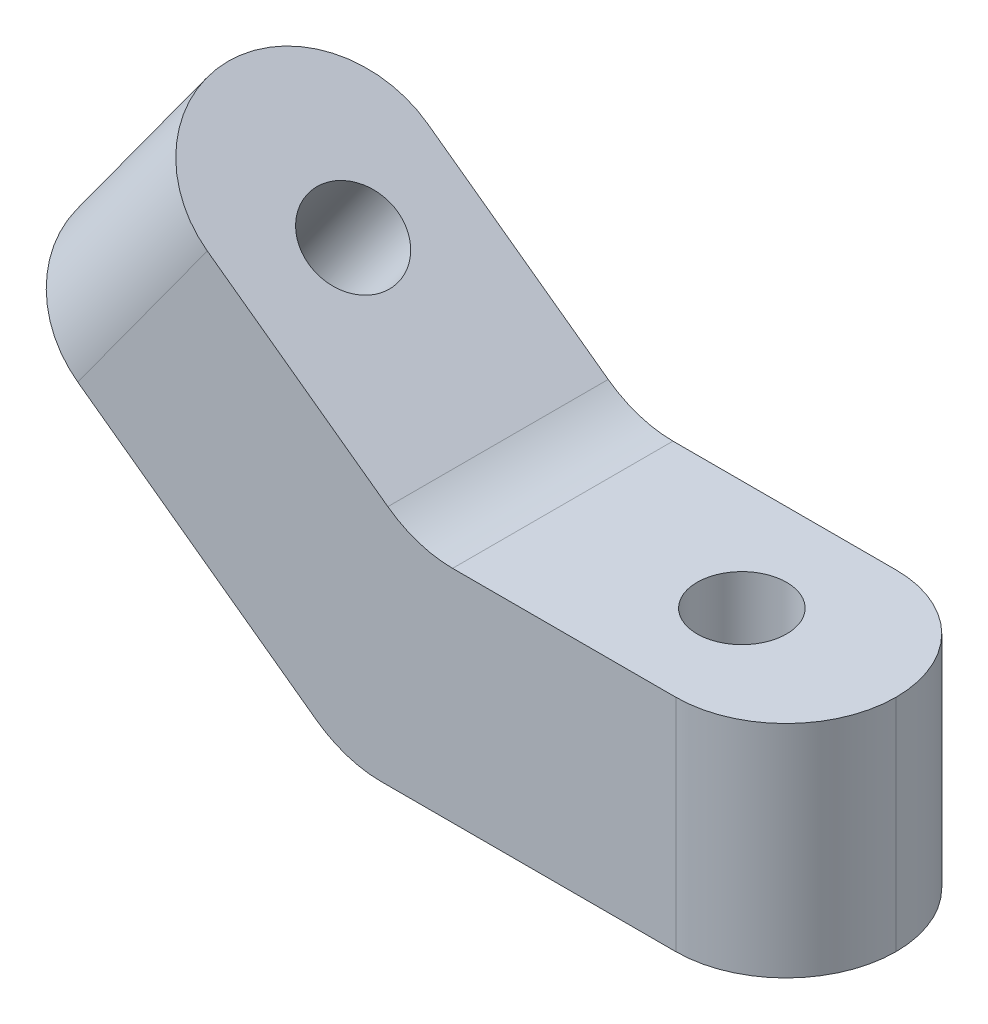
ISO-10303-21;
HEADER;
FILE_DESCRIPTION(('STEP AP214'),'2;1');
FILE_NAME('part.step','',(''),(''),'','','');
FILE_SCHEMA(('AUTOMOTIVE_DESIGN { 1 0 10303 214 1 1 1 1 }'));
ENDSEC;
DATA;
#1=APPLICATION_CONTEXT('core data for automotive mechanical design processes');
#2=APPLICATION_PROTOCOL_DEFINITION('international standard','automotive_design',2000,#1);
#3=PRODUCT_CONTEXT('',#1,'mechanical');
#4=PRODUCT('Part','Part','',(#3));
#5=PRODUCT_RELATED_PRODUCT_CATEGORY('part','',(#4));
#6=PRODUCT_DEFINITION_FORMATION('','',#4);
#7=PRODUCT_DEFINITION_CONTEXT('part definition',#1,'design');
#8=PRODUCT_DEFINITION('design','',#6,#7);
#9=PRODUCT_DEFINITION_SHAPE('','',#8);
#10=(LENGTH_UNIT() NAMED_UNIT(*) SI_UNIT(.MILLI.,.METRE.));
#11=(NAMED_UNIT(*) PLANE_ANGLE_UNIT() SI_UNIT($,.RADIAN.));
#12=(NAMED_UNIT(*) SI_UNIT($,.STERADIAN.) SOLID_ANGLE_UNIT());
#13=UNCERTAINTY_MEASURE_WITH_UNIT(LENGTH_MEASURE(1.E-05),#10,'distance_accuracy_value','');
#14=(GEOMETRIC_REPRESENTATION_CONTEXT(3) GLOBAL_UNCERTAINTY_ASSIGNED_CONTEXT((#13)) GLOBAL_UNIT_ASSIGNED_CONTEXT((#10,
#11,#12)) REPRESENTATION_CONTEXT('',''));
#15=CARTESIAN_POINT('',(0.,0.,0.));
#16=DIRECTION('',(0.,0.,1.));
#17=DIRECTION('',(1.,0.,0.));
#18=AXIS2_PLACEMENT_3D('',#15,#16,#17);
#19=CARTESIAN_POINT('',(27.8087565261199,8.00567294386291,12.7));
#20=DIRECTION('',(0.,-1.,0.));
#21=DIRECTION('',(1.,0.,0.));
#22=AXIS2_PLACEMENT_3D('',#19,#20,#21);
#23=PLANE('',#22);
#24=CARTESIAN_POINT('',(18.9187565261199,8.0056729438629,6.35));
#25=DIRECTION('',(0.,1.,0.));
#26=DIRECTION('',(-1.,0.,0.));
#27=AXIS2_PLACEMENT_3D('',#24,#25,#26);
#28=CIRCLE('',#27,2.5796875);
#29=CARTESIAN_POINT('',(16.3390690261199,8.0056729438629,6.35));
#30=VERTEX_POINT('',#29);
#31=EDGE_CURVE('E240',#30,#30,#28,.T.);
#32=ORIENTED_EDGE('',*,*,#31,.F.);
#33=EDGE_LOOP('',(#32));
#34=FACE_BOUND('',#33,.T.);
#35=DIRECTION('',(-1.,0.,0.));
#36=VECTOR('',#35,1.);
#37=CARTESIAN_POINT('',(27.8087565261199,8.00567294386291,0.));
#38=LINE('',#37,#36);
#39=CARTESIAN_POINT('',(21.4587565261199,8.0056729438629,0.));
#40=VERTEX_POINT('',#39);
#41=CARTESIAN_POINT('',(8.5984767393568,8.00567294386289,0.));
#42=VERTEX_POINT('',#41);
#43=EDGE_CURVE('E198',#40,#42,#38,.T.);
#44=ORIENTED_EDGE('',*,*,#43,.T.);
#45=DIRECTION('',(0.,0.,-1.));
#46=VECTOR('',#45,1.);
#47=CARTESIAN_POINT('',(8.5984767393568,8.00567294386289,12.7));
#48=LINE('',#47,#46);
#49=CARTESIAN_POINT('',(8.5984767393568,8.00567294386289,12.7));
#50=VERTEX_POINT('',#49);
#51=EDGE_CURVE('E182',#42,#50,#48,.F.);
#52=ORIENTED_EDGE('',*,*,#51,.T.);
#53=DIRECTION('',(-1.,0.,0.));
#54=VECTOR('',#53,1.);
#55=CARTESIAN_POINT('',(27.8087565261199,8.00567294386291,12.7));
#56=LINE('',#55,#54);
#57=CARTESIAN_POINT('',(21.4587565261199,8.0056729438629,12.7));
#58=VERTEX_POINT('',#57);
#59=EDGE_CURVE('E216',#58,#50,#56,.T.);
#60=ORIENTED_EDGE('',*,*,#59,.F.);
#61=CARTESIAN_POINT('',(21.4587565261199,8.0056729438629,6.35));
#62=DIRECTION('',(0.,-1.,0.));
#63=DIRECTION('',(1.,0.,0.));
#64=AXIS2_PLACEMENT_3D('',#61,#62,#63);
#65=CIRCLE('',#64,6.35);
#66=CARTESIAN_POINT('',(27.8087565261199,8.00567294386291,6.35));
#67=VERTEX_POINT('',#66);
#68=EDGE_CURVE('E157',#58,#67,#65,.F.);
#69=ORIENTED_EDGE('',*,*,#68,.T.);
#70=CARTESIAN_POINT('',(21.4587565261199,8.0056729438629,6.35));
#71=DIRECTION('',(0.,-1.,0.));
#72=DIRECTION('',(1.,0.,0.));
#73=AXIS2_PLACEMENT_3D('',#70,#71,#72);
#74=CIRCLE('',#73,6.35);
#75=EDGE_CURVE('E160',#67,#40,#74,.F.);
#76=ORIENTED_EDGE('',*,*,#75,.T.);
#77=EDGE_LOOP('',(#44,#52,#60,#69,#76));
#78=FACE_BOUND('',#77,.T.);
#79=ADVANCED_FACE('F39',(#34,#78),#23,.F.);
#80=CARTESIAN_POINT('',(6.53523666827784,8.00567294386289,12.7));
#81=DIRECTION('',(-0.587785252292474,-0.809016994374947,0.));
#82=DIRECTION('',(0.809016994374947,-0.587785252292474,0.));
#83=AXIS2_PLACEMENT_3D('',#80,#81,#82);
#84=PLANE('',#83);
#85=CARTESIAN_POINT('',(-3.48324134689601,15.2845232877734,6.35));
#86=DIRECTION('',(0.587785252292474,0.809016994374947,0.));
#87=DIRECTION('',(-0.809016994374947,0.587785252292474,0.));
#88=AXIS2_PLACEMENT_3D('',#85,#86,#87);
#89=CIRCLE('',#88,2.5796875);
#90=CARTESIAN_POINT('',(-5.57025237457263,16.8008255557967,6.35));
#91=VERTEX_POINT('',#90);
#92=EDGE_CURVE('E174',#91,#91,#89,.T.);
#93=ORIENTED_EDGE('',*,*,#92,.F.);
#94=EDGE_LOOP('',(#93));
#95=FACE_BOUND('',#94,.T.);
#96=DIRECTION('',(-0.809016994374947,0.587785252292474,0.));
#97=VECTOR('',#96,1.);
#98=CARTESIAN_POINT('',(6.53523666827784,8.00567294386289,12.7));
#99=LINE('',#98,#97);
#100=CARTESIAN_POINT('',(4.86604038729958,9.21841502958198,12.7));
#101=VERTEX_POINT('',#100);
#102=CARTESIAN_POINT('',(-5.53814451260838,16.7774978285963,12.7));
#103=VERTEX_POINT('',#102);
#104=EDGE_CURVE('E215',#101,#103,#99,.T.);
#105=ORIENTED_EDGE('',*,*,#104,.F.);
#106=DIRECTION('',(0.,0.,-1.));
#107=VECTOR('',#106,1.);
#108=CARTESIAN_POINT('',(4.86604038729958,9.21841502958198,0.));
#109=LINE('',#108,#107);
#110=CARTESIAN_POINT('',(4.86604038729958,9.21841502958198,0.));
#111=VERTEX_POINT('',#110);
#112=EDGE_CURVE('E170',#101,#111,#109,.T.);
#113=ORIENTED_EDGE('',*,*,#112,.T.);
#114=DIRECTION('',(-0.809016994374947,0.587785252292474,0.));
#115=VECTOR('',#114,1.);
#116=CARTESIAN_POINT('',(6.53523666827784,8.00567294386289,0.));
#117=LINE('',#116,#115);
#118=CARTESIAN_POINT('',(-5.53814451260838,16.7774978285963,0.));
#119=VERTEX_POINT('',#118);
#120=EDGE_CURVE('E134',#111,#119,#117,.T.);
#121=ORIENTED_EDGE('',*,*,#120,.T.);
#122=CARTESIAN_POINT('',(-5.53814451260838,16.7774978285963,6.35));
#123=DIRECTION('',(-0.587785252292474,-0.809016994374947,0.));
#124=DIRECTION('',(0.809016994374947,-0.587785252292474,0.));
#125=AXIS2_PLACEMENT_3D('',#122,#123,#124);
#126=CIRCLE('',#125,6.35);
#127=CARTESIAN_POINT('',(-10.6754024268893,20.5099341806535,6.35));
#128=VERTEX_POINT('',#127);
#129=EDGE_CURVE('E138',#119,#128,#126,.F.);
#130=ORIENTED_EDGE('',*,*,#129,.T.);
#131=CARTESIAN_POINT('',(-5.53814451260838,16.7774978285963,6.35));
#132=DIRECTION('',(-0.587785252292474,-0.809016994374947,0.));
#133=DIRECTION('',(0.809016994374947,-0.587785252292474,0.));
#134=AXIS2_PLACEMENT_3D('',#131,#132,#133);
#135=CIRCLE('',#134,6.35);
#136=EDGE_CURVE('E140',#128,#103,#135,.F.);
#137=ORIENTED_EDGE('',*,*,#136,.T.);
#138=EDGE_LOOP('',(#105,#113,#121,#130,#137));
#139=FACE_BOUND('',#138,.T.);
#140=ADVANCED_FACE('F218',(#95,#139),#84,.F.);
#141=CARTESIAN_POINT('',(-18.1402751310037,10.2354183520917,12.7));
#142=DIRECTION('',(0.587785252292474,0.809016994374947,0.));
#143=DIRECTION('',(-0.809016994374947,0.587785252292474,0.));
#144=AXIS2_PLACEMENT_3D('',#141,#142,#143);
#145=PLANE('',#144);
#146=CARTESIAN_POINT('',(-10.9481140510104,5.01000745921161,6.35));
#147=DIRECTION('',(0.587785252292474,0.809016994374947,0.));
#148=DIRECTION('',(-0.809016994374947,0.587785252292474,0.));
#149=AXIS2_PLACEMENT_3D('',#146,#147,#148);
#150=CIRCLE('',#149,2.5796875);
#151=CARTESIAN_POINT('',(-13.035125078687,6.52630972723485,6.35));
#152=VERTEX_POINT('',#151);
#153=EDGE_CURVE('E241',#152,#152,#150,.T.);
#154=ORIENTED_EDGE('',*,*,#153,.T.);
#155=EDGE_LOOP('',(#154));
#156=FACE_BOUND('',#155,.T.);
#157=DIRECTION('',(0.809016994374947,-0.587785252292474,0.));
#158=VECTOR('',#157,1.);
#159=CARTESIAN_POINT('',(-18.1402751310037,10.2354183520917,0.));
#160=LINE('',#159,#158);
#161=CARTESIAN_POINT('',(-13.0030172167228,6.50298200003451,0.));
#162=VERTEX_POINT('',#161);
#163=CARTESIAN_POINT('',(0.739560245141664,-3.48158497041802,0.));
#164=VERTEX_POINT('',#163);
#165=EDGE_CURVE('E118',#162,#164,#160,.T.);
#166=ORIENTED_EDGE('',*,*,#165,.T.);
#167=DIRECTION('',(0.,0.,-1.));
#168=VECTOR('',#167,1.);
#169=CARTESIAN_POINT('',(0.739560245141664,-3.48158497041802,12.7));
#170=LINE('',#169,#168);
#171=CARTESIAN_POINT('',(0.739560245141664,-3.48158497041802,12.7));
#172=VERTEX_POINT('',#171);
#173=EDGE_CURVE('E55',#164,#172,#170,.F.);
#174=ORIENTED_EDGE('',*,*,#173,.T.);
#175=DIRECTION('',(0.809016994374947,-0.587785252292474,0.));
#176=VECTOR('',#175,1.);
#177=CARTESIAN_POINT('',(-18.1402751310037,10.2354183520917,12.7));
#178=LINE('',#177,#176);
#179=CARTESIAN_POINT('',(-13.0030172167228,6.50298200003451,12.7));
#180=VERTEX_POINT('',#179);
#181=EDGE_CURVE('E222',#180,#172,#178,.T.);
#182=ORIENTED_EDGE('',*,*,#181,.F.);
#183=CARTESIAN_POINT('',(-13.0030172167228,6.50298200003451,6.35));
#184=DIRECTION('',(0.587785252292474,0.809016994374947,0.));
#185=DIRECTION('',(-0.809016994374947,0.587785252292474,0.));
#186=AXIS2_PLACEMENT_3D('',#183,#184,#185);
#187=CIRCLE('',#186,6.35);
#188=CARTESIAN_POINT('',(-18.1402751310037,10.2354183520917,6.35));
#189=VERTEX_POINT('',#188);
#190=EDGE_CURVE('E120',#180,#189,#187,.F.);
#191=ORIENTED_EDGE('',*,*,#190,.T.);
#192=CARTESIAN_POINT('',(-13.0030172167228,6.50298200003451,6.35));
#193=DIRECTION('',(0.587785252292474,0.809016994374947,0.));
#194=DIRECTION('',(-0.809016994374947,0.587785252292474,0.));
#195=AXIS2_PLACEMENT_3D('',#192,#193,#194);
#196=CIRCLE('',#195,6.35);
#197=EDGE_CURVE('E116',#189,#162,#196,.F.);
#198=ORIENTED_EDGE('',*,*,#197,.T.);
#199=EDGE_LOOP('',(#166,#174,#182,#191,#198));
#200=FACE_BOUND('',#199,.T.);
#201=ADVANCED_FACE('F117',(#156,#200),#145,.F.);
#202=CARTESIAN_POINT('',(2.40875652611991,-4.69432705613711,12.7));
#203=DIRECTION('',(0.,1.,0.));
#204=DIRECTION('',(-1.,0.,0.));
#205=AXIS2_PLACEMENT_3D('',#202,#203,#204);
#206=PLANE('',#205);
#207=CARTESIAN_POINT('',(18.9187565261199,-4.69432705613711,6.35));
#208=DIRECTION('',(0.,1.,0.));
#209=DIRECTION('',(-1.,0.,0.));
#210=AXIS2_PLACEMENT_3D('',#207,#208,#209);
#211=CIRCLE('',#210,2.5796875);
#212=CARTESIAN_POINT('',(16.3390690261199,-4.69432705613711,6.35));
#213=VERTEX_POINT('',#212);
#214=EDGE_CURVE('E208',#213,#213,#211,.T.);
#215=ORIENTED_EDGE('',*,*,#214,.T.);
#216=EDGE_LOOP('',(#215));
#217=FACE_BOUND('',#216,.T.);
#218=DIRECTION('',(1.,0.,0.));
#219=VECTOR('',#218,1.);
#220=CARTESIAN_POINT('',(2.40875652611991,-4.69432705613711,12.7));
#221=LINE('',#220,#219);
#222=CARTESIAN_POINT('',(4.47199659719887,-4.69432705613711,12.7));
#223=VERTEX_POINT('',#222);
#224=CARTESIAN_POINT('',(21.4587565261199,-4.6943270561371,12.7));
#225=VERTEX_POINT('',#224);
#226=EDGE_CURVE('E226',#223,#225,#221,.T.);
#227=ORIENTED_EDGE('',*,*,#226,.F.);
#228=DIRECTION('',(0.,0.,-1.));
#229=VECTOR('',#228,1.);
#230=CARTESIAN_POINT('',(4.47199659719887,-4.69432705613711,12.7));
#231=LINE('',#230,#229);
#232=CARTESIAN_POINT('',(4.47199659719887,-4.69432705613711,0.));
#233=VERTEX_POINT('',#232);
#234=EDGE_CURVE('E185',#223,#233,#231,.T.);
#235=ORIENTED_EDGE('',*,*,#234,.T.);
#236=DIRECTION('',(1.,0.,0.));
#237=VECTOR('',#236,1.);
#238=CARTESIAN_POINT('',(2.40875652611991,-4.69432705613711,0.));
#239=LINE('',#238,#237);
#240=CARTESIAN_POINT('',(21.4587565261199,-4.6943270561371,0.));
#241=VERTEX_POINT('',#240);
#242=EDGE_CURVE('E133',#233,#241,#239,.T.);
#243=ORIENTED_EDGE('',*,*,#242,.T.);
#244=CARTESIAN_POINT('',(21.4587565261199,-4.6943270561371,6.35));
#245=DIRECTION('',(0.,1.,0.));
#246=DIRECTION('',(-1.,0.,0.));
#247=AXIS2_PLACEMENT_3D('',#244,#245,#246);
#248=CIRCLE('',#247,6.35);
#249=CARTESIAN_POINT('',(27.8087565261199,-4.6943270561371,6.35));
#250=VERTEX_POINT('',#249);
#251=EDGE_CURVE('E167',#241,#250,#248,.F.);
#252=ORIENTED_EDGE('',*,*,#251,.T.);
#253=CARTESIAN_POINT('',(21.4587565261199,-4.6943270561371,6.35));
#254=DIRECTION('',(0.,1.,0.));
#255=DIRECTION('',(-1.,0.,0.));
#256=AXIS2_PLACEMENT_3D('',#253,#254,#255);
#257=CIRCLE('',#256,6.35);
#258=EDGE_CURVE('E163',#250,#225,#257,.F.);
#259=ORIENTED_EDGE('',*,*,#258,.T.);
#260=EDGE_LOOP('',(#227,#235,#243,#252,#259));
#261=FACE_BOUND('',#260,.T.);
#262=ADVANCED_FACE('F264',(#217,#261),#206,.F.);
#263=CARTESIAN_POINT('',(0.,0.,12.7));
#264=DIRECTION('',(0.,0.,1.));
#265=DIRECTION('',(1.,0.,0.));
#266=AXIS2_PLACEMENT_3D('',#263,#264,#265);
#267=PLANE('',#266);
#268=ORIENTED_EDGE('',*,*,#181,.T.);
#269=CARTESIAN_POINT('',(4.47199659719887,1.65567294386289,12.7));
#270=DIRECTION('',(0.,0.,1.));
#271=DIRECTION('',(1.,0.,0.));
#272=AXIS2_PLACEMENT_3D('',#269,#270,#271);
#273=CIRCLE('',#272,6.35);
#274=EDGE_CURVE('E193',#172,#223,#273,.T.);
#275=ORIENTED_EDGE('',*,*,#274,.T.);
#276=ORIENTED_EDGE('',*,*,#226,.T.);
#277=DIRECTION('',(0.,1.,0.));
#278=VECTOR('',#277,1.);
#279=CARTESIAN_POINT('',(21.4587565261199,8.00567294386291,12.7));
#280=LINE('',#279,#278);
#281=EDGE_CURVE('E151',#225,#58,#280,.T.);
#282=ORIENTED_EDGE('',*,*,#281,.T.);
#283=ORIENTED_EDGE('',*,*,#59,.T.);
#284=CARTESIAN_POINT('',(8.59847673935679,14.3556729438629,12.7));
#285=DIRECTION('',(0.,0.,1.));
#286=DIRECTION('',(1.,0.,0.));
#287=AXIS2_PLACEMENT_3D('',#284,#285,#286);
#288=CIRCLE('',#287,6.35);
#289=EDGE_CURVE('E11',#50,#101,#288,.F.);
#290=ORIENTED_EDGE('',*,*,#289,.T.);
#291=ORIENTED_EDGE('',*,*,#104,.T.);
#292=DIRECTION('',(-0.587785252292477,-0.809016994374945,0.));
#293=VECTOR('',#292,1.);
#294=CARTESIAN_POINT('',(-13.0030172167228,6.5029820000345,12.7));
#295=LINE('',#294,#293);
#296=EDGE_CURVE('E154',#103,#180,#295,.T.);
#297=ORIENTED_EDGE('',*,*,#296,.T.);
#298=EDGE_LOOP('',(#268,#275,#276,#282,#283,#290,#291,#297));
#299=FACE_BOUND('',#298,.T.);
#300=ADVANCED_FACE('F214',(#299),#267,.T.);
#301=CARTESIAN_POINT('',(0.,0.,0.));
#302=DIRECTION('',(0.,0.,1.));
#303=DIRECTION('',(1.,0.,0.));
#304=AXIS2_PLACEMENT_3D('',#301,#302,#303);
#305=PLANE('',#304);
#306=ORIENTED_EDGE('',*,*,#242,.F.);
#307=CARTESIAN_POINT('',(4.47199659719887,1.65567294386289,0.));
#308=DIRECTION('',(0.,0.,1.));
#309=DIRECTION('',(1.,0.,0.));
#310=AXIS2_PLACEMENT_3D('',#307,#308,#309);
#311=CIRCLE('',#310,6.35);
#312=EDGE_CURVE('E63',#233,#164,#311,.F.);
#313=ORIENTED_EDGE('',*,*,#312,.T.);
#314=ORIENTED_EDGE('',*,*,#165,.F.);
#315=DIRECTION('',(-0.587785252292477,-0.809016994374945,0.));
#316=VECTOR('',#315,1.);
#317=CARTESIAN_POINT('',(-11.6029369606615,8.43002715168593,0.));
#318=LINE('',#317,#316);
#319=EDGE_CURVE('E131',#162,#119,#318,.F.);
#320=ORIENTED_EDGE('',*,*,#319,.T.);
#321=ORIENTED_EDGE('',*,*,#120,.F.);
#322=CARTESIAN_POINT('',(8.59847673935679,14.3556729438629,0.));
#323=DIRECTION('',(0.,0.,1.));
#324=DIRECTION('',(1.,0.,0.));
#325=AXIS2_PLACEMENT_3D('',#322,#323,#324);
#326=CIRCLE('',#325,6.35);
#327=EDGE_CURVE('E48',#111,#42,#326,.T.);
#328=ORIENTED_EDGE('',*,*,#327,.T.);
#329=ORIENTED_EDGE('',*,*,#43,.F.);
#330=DIRECTION('',(0.,1.,0.));
#331=VECTOR('',#330,1.);
#332=CARTESIAN_POINT('',(21.4587565261199,0.,0.));
#333=LINE('',#332,#331);
#334=EDGE_CURVE('E126',#40,#241,#333,.F.);
#335=ORIENTED_EDGE('',*,*,#334,.T.);
#336=EDGE_LOOP('',(#306,#313,#314,#320,#321,#328,#329,#335));
#337=FACE_BOUND('',#336,.T.);
#338=ADVANCED_FACE('F129',(#337),#305,.F.);
#339=CARTESIAN_POINT('',(18.9187565261199,-18.1563270561371,6.35));
#340=DIRECTION('',(0.,1.,0.));
#341=DIRECTION('',(-1.,0.,0.));
#342=AXIS2_PLACEMENT_3D('',#339,#340,#341);
#343=CYLINDRICAL_SURFACE('',#342,2.5796875);
#344=ORIENTED_EDGE('',*,*,#31,.T.);
#345=EDGE_LOOP('',(#344));
#346=FACE_BOUND('',#345,.T.);
#347=ORIENTED_EDGE('',*,*,#214,.F.);
#348=EDGE_LOOP('',(#347));
#349=FACE_BOUND('',#348,.T.);
#350=ADVANCED_FACE('F307',(#346,#349),#343,.F.);
#351=CARTESIAN_POINT('',(-18.8608791173717,-5.88097931906393,6.35));
#352=DIRECTION('',(0.587785252292474,0.809016994374947,0.));
#353=DIRECTION('',(-0.809016994374947,0.587785252292474,0.));
#354=AXIS2_PLACEMENT_3D('',#351,#352,#353);
#355=CYLINDRICAL_SURFACE('',#354,2.5796875);
#356=ORIENTED_EDGE('',*,*,#92,.T.);
#357=EDGE_LOOP('',(#356));
#358=FACE_BOUND('',#357,.T.);
#359=ORIENTED_EDGE('',*,*,#153,.F.);
#360=EDGE_LOOP('',(#359));
#361=FACE_BOUND('',#360,.T.);
#362=ADVANCED_FACE('F255',(#358,#361),#355,.F.);
#363=CARTESIAN_POINT('',(-11.6029369606615,8.43002715168593,6.35));
#364=DIRECTION('',(0.587785252292477,0.809016994374945,0.));
#365=DIRECTION('',(-0.809016994374945,0.587785252292477,0.));
#366=AXIS2_PLACEMENT_3D('',#363,#364,#365);
#367=CYLINDRICAL_SURFACE('',#366,6.35);
#368=ORIENTED_EDGE('',*,*,#296,.F.);
#369=ORIENTED_EDGE('',*,*,#136,.F.);
#370=DIRECTION('',(-0.587785252292477,-0.809016994374945,0.));
#371=VECTOR('',#370,1.);
#372=CARTESIAN_POINT('',(-10.6754024268893,20.5099341806535,6.35));
#373=LINE('',#372,#371);
#374=EDGE_CURVE('E171',#189,#128,#373,.F.);
#375=ORIENTED_EDGE('',*,*,#374,.F.);
#376=ORIENTED_EDGE('',*,*,#190,.F.);
#377=EDGE_LOOP('',(#368,#369,#375,#376));
#378=FACE_BOUND('',#377,.T.);
#379=ADVANCED_FACE('F273',(#378),#367,.T.);
#380=CARTESIAN_POINT('',(-5.53814451260839,16.7774978285963,6.35));
#381=DIRECTION('',(-0.587785252292477,-0.809016994374945,0.));
#382=DIRECTION('',(0.809016994374945,-0.587785252292477,0.));
#383=AXIS2_PLACEMENT_3D('',#380,#381,#382);
#384=CYLINDRICAL_SURFACE('',#383,6.35);
#385=ORIENTED_EDGE('',*,*,#129,.F.);
#386=ORIENTED_EDGE('',*,*,#319,.F.);
#387=ORIENTED_EDGE('',*,*,#197,.F.);
#388=ORIENTED_EDGE('',*,*,#374,.T.);
#389=EDGE_LOOP('',(#385,#386,#387,#388));
#390=FACE_BOUND('',#389,.T.);
#391=ADVANCED_FACE('F137',(#390),#384,.T.);
#392=CARTESIAN_POINT('',(21.4587565261199,0.,6.35));
#393=DIRECTION('',(0.,-1.,0.));
#394=DIRECTION('',(0.,0.,-1.));
#395=AXIS2_PLACEMENT_3D('',#392,#393,#394);
#396=CYLINDRICAL_SURFACE('',#395,6.35);
#397=ORIENTED_EDGE('',*,*,#281,.F.);
#398=ORIENTED_EDGE('',*,*,#258,.F.);
#399=DIRECTION('',(0.,1.,0.));
#400=VECTOR('',#399,1.);
#401=CARTESIAN_POINT('',(27.8087565261199,-4.6943270561371,6.35));
#402=LINE('',#401,#400);
#403=EDGE_CURVE('E175',#67,#250,#402,.F.);
#404=ORIENTED_EDGE('',*,*,#403,.F.);
#405=ORIENTED_EDGE('',*,*,#68,.F.);
#406=EDGE_LOOP('',(#397,#398,#404,#405));
#407=FACE_BOUND('',#406,.T.);
#408=ADVANCED_FACE('F272',(#407),#396,.T.);
#409=CARTESIAN_POINT('',(21.4587565261199,-4.6943270561371,6.35));
#410=DIRECTION('',(0.,1.,0.));
#411=DIRECTION('',(0.,0.,1.));
#412=AXIS2_PLACEMENT_3D('',#409,#410,#411);
#413=CYLINDRICAL_SURFACE('',#412,6.35);
#414=ORIENTED_EDGE('',*,*,#251,.F.);
#415=ORIENTED_EDGE('',*,*,#334,.F.);
#416=ORIENTED_EDGE('',*,*,#75,.F.);
#417=ORIENTED_EDGE('',*,*,#403,.T.);
#418=EDGE_LOOP('',(#414,#415,#416,#417));
#419=FACE_BOUND('',#418,.T.);
#420=ADVANCED_FACE('F277',(#419),#413,.T.);
#421=CARTESIAN_POINT('',(8.59847673935679,14.3556729438629,12.7));
#422=DIRECTION('',(0.,0.,1.));
#423=DIRECTION('',(1.,0.,0.));
#424=AXIS2_PLACEMENT_3D('',#421,#422,#423);
#425=CYLINDRICAL_SURFACE('',#424,6.35);
#426=ORIENTED_EDGE('',*,*,#289,.F.);
#427=ORIENTED_EDGE('',*,*,#51,.F.);
#428=ORIENTED_EDGE('',*,*,#327,.F.);
#429=ORIENTED_EDGE('',*,*,#112,.F.);
#430=EDGE_LOOP('',(#426,#427,#428,#429));
#431=FACE_BOUND('',#430,.T.);
#432=ADVANCED_FACE('F211',(#431),#425,.F.);
#433=CARTESIAN_POINT('',(4.47199659719887,1.65567294386289,12.7));
#434=DIRECTION('',(0.,0.,-1.));
#435=DIRECTION('',(-1.,0.,0.));
#436=AXIS2_PLACEMENT_3D('',#433,#434,#435);
#437=CYLINDRICAL_SURFACE('',#436,6.35);
#438=ORIENTED_EDGE('',*,*,#274,.F.);
#439=ORIENTED_EDGE('',*,*,#173,.F.);
#440=ORIENTED_EDGE('',*,*,#312,.F.);
#441=ORIENTED_EDGE('',*,*,#234,.F.);
#442=EDGE_LOOP('',(#438,#439,#440,#441));
#443=FACE_BOUND('',#442,.T.);
#444=ADVANCED_FACE('F41',(#443),#437,.T.);
#445=CLOSED_SHELL('',(#79,#140,#201,#262,#300,#338,#350,#362,#379,#391,#408,#420,#432,#444));
#446=MANIFOLD_SOLID_BREP('B2',#445);
#447=ADVANCED_BREP_SHAPE_REPRESENTATION('',(#18,#446),#14);
#448=SHAPE_DEFINITION_REPRESENTATION(#9,#447);
ENDSEC;
END-ISO-10303-21;
